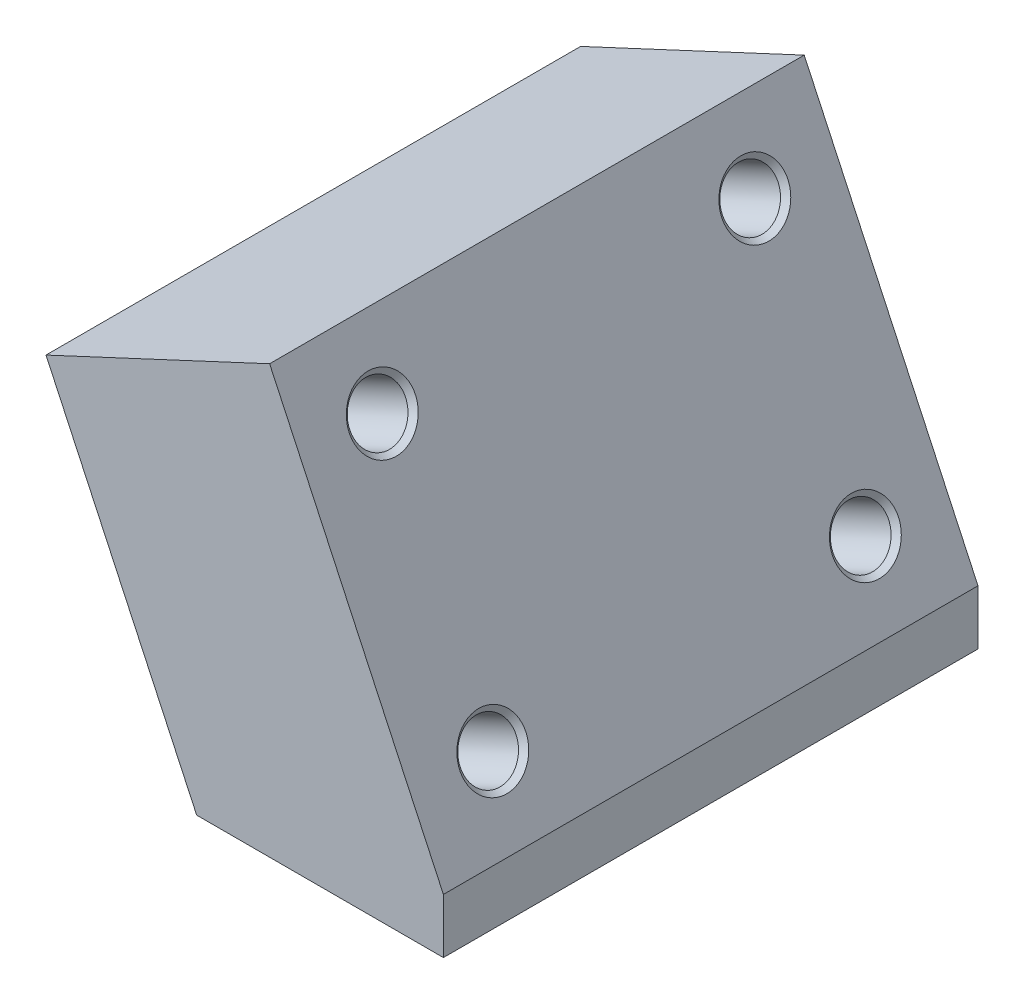
ISO-10303-21;
HEADER;
FILE_DESCRIPTION(('STEP AP214'),'2;1');
FILE_NAME('part.step','',(''),(''),'','','');
FILE_SCHEMA(('AUTOMOTIVE_DESIGN { 1 0 10303 214 1 1 1 1 }'));
ENDSEC;
DATA;
#1=APPLICATION_CONTEXT('core data for automotive mechanical design processes');
#2=APPLICATION_PROTOCOL_DEFINITION('international standard','automotive_design',2000,#1);
#3=PRODUCT_CONTEXT('',#1,'mechanical');
#4=PRODUCT('Part','Part','',(#3));
#5=PRODUCT_RELATED_PRODUCT_CATEGORY('part','',(#4));
#6=PRODUCT_DEFINITION_FORMATION('','',#4);
#7=PRODUCT_DEFINITION_CONTEXT('part definition',#1,'design');
#8=PRODUCT_DEFINITION('design','',#6,#7);
#9=PRODUCT_DEFINITION_SHAPE('','',#8);
#10=(LENGTH_UNIT() NAMED_UNIT(*) SI_UNIT(.MILLI.,.METRE.));
#11=(NAMED_UNIT(*) PLANE_ANGLE_UNIT() SI_UNIT($,.RADIAN.));
#12=(NAMED_UNIT(*) SI_UNIT($,.STERADIAN.) SOLID_ANGLE_UNIT());
#13=UNCERTAINTY_MEASURE_WITH_UNIT(LENGTH_MEASURE(1.E-05),#10,'distance_accuracy_value','');
#14=(GEOMETRIC_REPRESENTATION_CONTEXT(3) GLOBAL_UNCERTAINTY_ASSIGNED_CONTEXT((#13)) GLOBAL_UNIT_ASSIGNED_CONTEXT((#10,
#11,#12)) REPRESENTATION_CONTEXT('',''));
#15=CARTESIAN_POINT('',(0.,0.,0.));
#16=DIRECTION('',(0.,0.,1.));
#17=DIRECTION('',(1.,0.,0.));
#18=AXIS2_PLACEMENT_3D('',#15,#16,#17);
#19=CARTESIAN_POINT('',(1.18032298381495,-74.8106195494456,32.5));
#20=DIRECTION('',(0.422618261740701,-0.906307787036649,0.));
#21=DIRECTION('',(0.906307787036649,0.422618261740701,0.));
#22=AXIS2_PLACEMENT_3D('',#19,#20,#21);
#23=PLANE('',#22);
#24=DIRECTION('',(-0.906307787036649,-0.422618261740701,0.));
#25=VECTOR('',#24,1.);
#26=CARTESIAN_POINT('',(1.18032298381495,-74.8106195494456,-32.5));
#27=LINE('',#26,#25);
#28=CARTESIAN_POINT('',(28.3695565949144,-62.1320716972246,-32.5));
#29=VERTEX_POINT('',#28);
#30=CARTESIAN_POINT('',(1.18032298381495,-74.8106195494456,-32.5));
#31=VERTEX_POINT('',#30);
#32=EDGE_CURVE('E116',#29,#31,#27,.T.);
#33=ORIENTED_EDGE('',*,*,#32,.T.);
#34=DIRECTION('',(0.,0.,-1.));
#35=VECTOR('',#34,1.);
#36=CARTESIAN_POINT('',(1.18032298381495,-74.8106195494456,32.5));
#37=LINE('',#36,#35);
#38=CARTESIAN_POINT('',(1.18032298381495,-74.8106195494456,32.5));
#39=VERTEX_POINT('',#38);
#40=EDGE_CURVE('E11',#39,#31,#37,.T.);
#41=ORIENTED_EDGE('',*,*,#40,.F.);
#42=DIRECTION('',(-0.906307787036649,-0.422618261740701,0.));
#43=VECTOR('',#42,1.);
#44=CARTESIAN_POINT('',(1.18032298381495,-74.8106195494456,32.5));
#45=LINE('',#44,#43);
#46=CARTESIAN_POINT('',(28.3695565949144,-62.1320716972246,32.5));
#47=VERTEX_POINT('',#46);
#48=EDGE_CURVE('E125',#47,#39,#45,.T.);
#49=ORIENTED_EDGE('',*,*,#48,.F.);
#50=DIRECTION('',(0.,0.,-1.));
#51=VECTOR('',#50,1.);
#52=CARTESIAN_POINT('',(28.3695565949144,-62.1320716972246,32.5));
#53=LINE('',#52,#51);
#54=EDGE_CURVE('E112',#47,#29,#53,.T.);
#55=ORIENTED_EDGE('',*,*,#54,.T.);
#56=EDGE_LOOP('',(#33,#41,#49,#55));
#57=FACE_BOUND('',#56,.T.);
#58=ADVANCED_FACE('F37',(#57),#23,.F.);
#59=CARTESIAN_POINT('',(1.18032298381495,-74.8106195494456,32.5));
#60=DIRECTION('',(0.906307787036649,0.422618261740701,0.));
#61=DIRECTION('',(-0.422618261740701,0.906307787036649,0.));
#62=AXIS2_PLACEMENT_3D('',#59,#60,#61);
#63=PLANE('',#62);
#64=DIRECTION('',(0.422618261740701,-0.906307787036649,0.));
#65=VECTOR('',#64,1.);
#66=CARTESIAN_POINT('',(1.18032298381495,-74.8106195494456,-32.5));
#67=LINE('',#66,#65);
#68=CARTESIAN_POINT('',(19.5004696819495,-114.098300928345,-32.5));
#69=VERTEX_POINT('',#68);
#70=EDGE_CURVE('E119',#31,#69,#67,.T.);
#71=ORIENTED_EDGE('',*,*,#70,.T.);
#72=DIRECTION('',(0.,0.,-1.));
#73=VECTOR('',#72,1.);
#74=CARTESIAN_POINT('',(19.5004696819495,-114.098300928345,32.5));
#75=LINE('',#74,#73);
#76=CARTESIAN_POINT('',(19.5004696819495,-114.098300928345,32.5));
#77=VERTEX_POINT('',#76);
#78=EDGE_CURVE('E46',#77,#69,#75,.T.);
#79=ORIENTED_EDGE('',*,*,#78,.F.);
#80=DIRECTION('',(0.422618261740701,-0.906307787036649,0.));
#81=VECTOR('',#80,1.);
#82=CARTESIAN_POINT('',(1.18032298381495,-74.8106195494456,32.5));
#83=LINE('',#82,#81);
#84=EDGE_CURVE('E90',#39,#77,#83,.T.);
#85=ORIENTED_EDGE('',*,*,#84,.F.);
#86=ORIENTED_EDGE('',*,*,#40,.T.);
#87=EDGE_LOOP('',(#71,#79,#85,#86));
#88=FACE_BOUND('',#87,.T.);
#89=ADVANCED_FACE('F180',(#88),#63,.F.);
#90=CARTESIAN_POINT('',(49.5004696819495,-114.098300928345,32.5));
#91=DIRECTION('',(0.,1.,0.));
#92=DIRECTION('',(0.,0.,1.));
#93=AXIS2_PLACEMENT_3D('',#90,#91,#92);
#94=PLANE('',#93);
#95=CARTESIAN_POINT('',(34.5004696819495,-114.098300928345,-10.));
#96=DIRECTION('',(0.,1.,0.));
#97=DIRECTION('',(0.,0.,1.));
#98=AXIS2_PLACEMENT_3D('',#95,#96,#97);
#99=CIRCLE('',#98,3.39999999999999);
#100=CARTESIAN_POINT('',(34.5004696819495,-114.098300928345,-6.60000000000001));
#101=VERTEX_POINT('',#100);
#102=EDGE_CURVE('E40',#101,#101,#99,.T.);
#103=ORIENTED_EDGE('',*,*,#102,.T.);
#104=EDGE_LOOP('',(#103));
#105=FACE_BOUND('',#104,.T.);
#106=CARTESIAN_POINT('',(34.5004696819495,-114.098300928345,10.));
#107=DIRECTION('',(0.,1.,0.));
#108=DIRECTION('',(0.,0.,1.));
#109=AXIS2_PLACEMENT_3D('',#106,#107,#108);
#110=CIRCLE('',#109,3.39999999999999);
#111=CARTESIAN_POINT('',(34.5004696819495,-114.098300928345,13.4));
#112=VERTEX_POINT('',#111);
#113=EDGE_CURVE('E128',#112,#112,#110,.T.);
#114=ORIENTED_EDGE('',*,*,#113,.T.);
#115=EDGE_LOOP('',(#114));
#116=FACE_BOUND('',#115,.T.);
#117=DIRECTION('',(1.,0.,0.));
#118=VECTOR('',#117,1.);
#119=CARTESIAN_POINT('',(49.5004696819495,-114.098300928345,-32.5));
#120=LINE('',#119,#118);
#121=CARTESIAN_POINT('',(49.5004696819495,-114.098300928345,-32.5));
#122=VERTEX_POINT('',#121);
#123=EDGE_CURVE('E107',#69,#122,#120,.T.);
#124=ORIENTED_EDGE('',*,*,#123,.T.);
#125=DIRECTION('',(0.,0.,-1.));
#126=VECTOR('',#125,1.);
#127=CARTESIAN_POINT('',(49.5004696819495,-114.098300928345,32.5));
#128=LINE('',#127,#126);
#129=CARTESIAN_POINT('',(49.5004696819495,-114.098300928345,32.5));
#130=VERTEX_POINT('',#129);
#131=EDGE_CURVE('E104',#130,#122,#128,.T.);
#132=ORIENTED_EDGE('',*,*,#131,.F.);
#133=DIRECTION('',(1.,0.,0.));
#134=VECTOR('',#133,1.);
#135=CARTESIAN_POINT('',(49.5004696819495,-114.098300928345,32.5));
#136=LINE('',#135,#134);
#137=EDGE_CURVE('E96',#77,#130,#136,.T.);
#138=ORIENTED_EDGE('',*,*,#137,.F.);
#139=ORIENTED_EDGE('',*,*,#78,.T.);
#140=EDGE_LOOP('',(#124,#132,#138,#139));
#141=FACE_BOUND('',#140,.T.);
#142=ADVANCED_FACE('F105',(#105,#116,#141),#94,.F.);
#143=CARTESIAN_POINT('',(49.5004696819495,-114.098300928345,32.5));
#144=DIRECTION('',(-1.,0.,0.));
#145=DIRECTION('',(0.,0.,1.));
#146=AXIS2_PLACEMENT_3D('',#143,#144,#145);
#147=PLANE('',#146);
#148=DIRECTION('',(0.,1.,0.));
#149=VECTOR('',#148,1.);
#150=CARTESIAN_POINT('',(49.5004696819495,-114.098300928345,-32.5));
#151=LINE('',#150,#149);
#152=CARTESIAN_POINT('',(49.5004696819495,-107.447461049057,-32.5));
#153=VERTEX_POINT('',#152);
#154=EDGE_CURVE('E76',#122,#153,#151,.T.);
#155=ORIENTED_EDGE('',*,*,#154,.T.);
#156=DIRECTION('',(0.,0.,-1.));
#157=VECTOR('',#156,1.);
#158=CARTESIAN_POINT('',(49.5004696819495,-107.447461049057,32.5));
#159=LINE('',#158,#157);
#160=CARTESIAN_POINT('',(49.5004696819495,-107.447461049057,32.5));
#161=VERTEX_POINT('',#160);
#162=EDGE_CURVE('E108',#161,#153,#159,.T.);
#163=ORIENTED_EDGE('',*,*,#162,.F.);
#164=DIRECTION('',(0.,1.,0.));
#165=VECTOR('',#164,1.);
#166=CARTESIAN_POINT('',(49.5004696819495,-114.098300928345,32.5));
#167=LINE('',#166,#165);
#168=EDGE_CURVE('E100',#130,#161,#167,.T.);
#169=ORIENTED_EDGE('',*,*,#168,.F.);
#170=ORIENTED_EDGE('',*,*,#131,.T.);
#171=EDGE_LOOP('',(#155,#163,#169,#170));
#172=FACE_BOUND('',#171,.T.);
#173=ADVANCED_FACE('F110',(#172),#147,.F.);
#174=CARTESIAN_POINT('',(49.5004696819495,-107.447461049057,32.5));
#175=DIRECTION('',(-0.906307787036649,-0.422618261740701,0.));
#176=DIRECTION('',(0.422618261740701,-0.906307787036649,0.));
#177=AXIS2_PLACEMENT_3D('',#174,#175,#176);
#178=PLANE('',#177);
#179=CARTESIAN_POINT('',(32.2153827767583,-70.3794725592654,22.65));
#180=DIRECTION('',(0.906307787036649,0.422618261740701,0.));
#181=DIRECTION('',(-0.422618261740701,0.906307787036649,0.));
#182=AXIS2_PLACEMENT_3D('',#179,#180,#181);
#183=CIRCLE('',#182,4.025);
#184=CARTESIAN_POINT('',(30.5143442732519,-66.7315837164429,22.65));
#185=VERTEX_POINT('',#184);
#186=EDGE_CURVE('E130',#185,#185,#183,.T.);
#187=ORIENTED_EDGE('',*,*,#186,.F.);
#188=EDGE_LOOP('',(#187));
#189=FACE_BOUND('',#188,.T.);
#190=CARTESIAN_POINT('',(45.6546435001057,-99.2000601870162,22.65));
#191=DIRECTION('',(0.906307787036649,0.422618261740701,0.));
#192=DIRECTION('',(-0.422618261740701,0.906307787036649,0.));
#193=AXIS2_PLACEMENT_3D('',#190,#191,#192);
#194=CIRCLE('',#193,4.025);
#195=CARTESIAN_POINT('',(43.9536049965994,-95.5521713441937,22.65));
#196=VERTEX_POINT('',#195);
#197=EDGE_CURVE('E150',#196,#196,#194,.T.);
#198=ORIENTED_EDGE('',*,*,#197,.F.);
#199=EDGE_LOOP('',(#198));
#200=FACE_BOUND('',#199,.T.);
#201=CARTESIAN_POINT('',(45.6546435001057,-99.2000601870162,-22.65));
#202=DIRECTION('',(0.906307787036649,0.422618261740701,0.));
#203=DIRECTION('',(-0.422618261740701,0.906307787036649,0.));
#204=AXIS2_PLACEMENT_3D('',#201,#202,#203);
#205=CIRCLE('',#204,4.025);
#206=CARTESIAN_POINT('',(43.9536049965994,-95.5521713441937,-22.65));
#207=VERTEX_POINT('',#206);
#208=EDGE_CURVE('E159',#207,#207,#205,.T.);
#209=ORIENTED_EDGE('',*,*,#208,.F.);
#210=EDGE_LOOP('',(#209));
#211=FACE_BOUND('',#210,.T.);
#212=CARTESIAN_POINT('',(32.2153827767583,-70.3794725592654,-22.65));
#213=DIRECTION('',(0.906307787036649,0.422618261740701,0.));
#214=DIRECTION('',(-0.422618261740701,0.906307787036649,0.));
#215=AXIS2_PLACEMENT_3D('',#212,#213,#214);
#216=CIRCLE('',#215,4.025);
#217=CARTESIAN_POINT('',(30.5143442732519,-66.7315837164429,-22.65));
#218=VERTEX_POINT('',#217);
#219=EDGE_CURVE('E168',#218,#218,#216,.T.);
#220=ORIENTED_EDGE('',*,*,#219,.F.);
#221=EDGE_LOOP('',(#220));
#222=FACE_BOUND('',#221,.T.);
#223=DIRECTION('',(-0.422618261740701,0.906307787036649,0.));
#224=VECTOR('',#223,1.);
#225=CARTESIAN_POINT('',(49.5004696819495,-107.447461049057,-32.5));
#226=LINE('',#225,#224);
#227=EDGE_CURVE('E82',#153,#29,#226,.T.);
#228=ORIENTED_EDGE('',*,*,#227,.T.);
#229=ORIENTED_EDGE('',*,*,#54,.F.);
#230=DIRECTION('',(-0.422618261740701,0.906307787036649,0.));
#231=VECTOR('',#230,1.);
#232=CARTESIAN_POINT('',(49.5004696819495,-107.447461049057,32.5));
#233=LINE('',#232,#231);
#234=EDGE_CURVE('E55',#161,#47,#233,.T.);
#235=ORIENTED_EDGE('',*,*,#234,.F.);
#236=ORIENTED_EDGE('',*,*,#162,.T.);
#237=EDGE_LOOP('',(#228,#229,#235,#236));
#238=FACE_BOUND('',#237,.T.);
#239=ADVANCED_FACE('F193',(#189,#200,#211,#222,#238),#178,.F.);
#240=CARTESIAN_POINT('',(0.,0.,32.5));
#241=DIRECTION('',(0.,0.,1.));
#242=DIRECTION('',(1.,0.,0.));
#243=AXIS2_PLACEMENT_3D('',#240,#241,#242);
#244=PLANE('',#243);
#245=ORIENTED_EDGE('',*,*,#48,.T.);
#246=ORIENTED_EDGE('',*,*,#84,.T.);
#247=ORIENTED_EDGE('',*,*,#137,.T.);
#248=ORIENTED_EDGE('',*,*,#168,.T.);
#249=ORIENTED_EDGE('',*,*,#234,.T.);
#250=EDGE_LOOP('',(#245,#246,#247,#248,#249));
#251=FACE_BOUND('',#250,.T.);
#252=ADVANCED_FACE('F98',(#251),#244,.T.);
#253=CARTESIAN_POINT('',(0.,0.,-32.5));
#254=DIRECTION('',(0.,0.,1.));
#255=DIRECTION('',(1.,0.,0.));
#256=AXIS2_PLACEMENT_3D('',#253,#254,#255);
#257=PLANE('',#256);
#258=ORIENTED_EDGE('',*,*,#32,.F.);
#259=ORIENTED_EDGE('',*,*,#227,.F.);
#260=ORIENTED_EDGE('',*,*,#154,.F.);
#261=ORIENTED_EDGE('',*,*,#123,.F.);
#262=ORIENTED_EDGE('',*,*,#70,.F.);
#263=EDGE_LOOP('',(#258,#259,#260,#261,#262));
#264=FACE_BOUND('',#263,.T.);
#265=ADVANCED_FACE('F182',(#264),#257,.F.);
#266=CARTESIAN_POINT('',(14.0892270360253,-78.8318377940794,-22.65));
#267=DIRECTION('',(0.906307787036649,0.422618261740701,0.));
#268=DIRECTION('',(-0.422618261740701,0.906307787036649,0.));
#269=AXIS2_PLACEMENT_3D('',#266,#267,#268);
#270=CONICAL_SURFACE('',#269,3.4,1.02974425867665);
#271=CARTESIAN_POINT('',(12.2377071990009,-79.6952156733098,-22.65));
#272=VERTEX_POINT('',#271);
#273=VERTEX_LOOP('',#272);
#274=FACE_BOUND('',#273,.T.);
#275=CARTESIAN_POINT('',(14.0892270360253,-78.8318377940794,-22.65));
#276=DIRECTION('',(0.906307787036649,0.422618261740701,0.));
#277=DIRECTION('',(-0.422618261740701,0.906307787036649,0.));
#278=AXIS2_PLACEMENT_3D('',#275,#276,#277);
#279=CIRCLE('',#278,3.4);
#280=CARTESIAN_POINT('',(12.6523249461069,-75.7503913181548,-22.65));
#281=VERTEX_POINT('',#280);
#282=EDGE_CURVE('E120',#281,#281,#279,.T.);
#283=ORIENTED_EDGE('',*,*,#282,.T.);
#284=EDGE_LOOP('',(#283));
#285=FACE_BOUND('',#284,.T.);
#286=ADVANCED_FACE('F184',(#274,#285),#270,.F.);
#287=CARTESIAN_POINT('',(32.2153827767583,-70.3794725592654,-22.65));
#288=DIRECTION('',(0.906307787036649,0.422618261740701,0.));
#289=DIRECTION('',(-0.422618261740701,0.906307787036649,0.));
#290=AXIS2_PLACEMENT_3D('',#287,#288,#289);
#291=CYLINDRICAL_SURFACE('',#290,3.4);
#292=ORIENTED_EDGE('',*,*,#282,.F.);
#293=EDGE_LOOP('',(#292));
#294=FACE_BOUND('',#293,.T.);
#295=CARTESIAN_POINT('',(31.6489404098603,-70.6436089728533,-22.65));
#296=DIRECTION('',(0.906307787036649,0.422618261740701,0.));
#297=DIRECTION('',(-0.422618261740701,0.906307787036649,0.));
#298=AXIS2_PLACEMENT_3D('',#295,#296,#297);
#299=CIRCLE('',#298,3.4);
#300=CARTESIAN_POINT('',(30.212038319942,-67.5621624969287,-22.65));
#301=VERTEX_POINT('',#300);
#302=EDGE_CURVE('E171',#301,#301,#299,.T.);
#303=ORIENTED_EDGE('',*,*,#302,.T.);
#304=EDGE_LOOP('',(#303));
#305=FACE_BOUND('',#304,.T.);
#306=ADVANCED_FACE('F190',(#294,#305),#291,.F.);
#307=CARTESIAN_POINT('',(32.2153827767583,-70.3794725592654,-22.65));
#308=DIRECTION('',(0.906307787036649,0.422618261740701,0.));
#309=DIRECTION('',(-0.422618261740701,0.906307787036649,0.));
#310=AXIS2_PLACEMENT_3D('',#307,#308,#309);
#311=CONICAL_SURFACE('',#310,4.025,0.785398163397449);
#312=ORIENTED_EDGE('',*,*,#302,.F.);
#313=EDGE_LOOP('',(#312));
#314=FACE_BOUND('',#313,.T.);
#315=ORIENTED_EDGE('',*,*,#219,.T.);
#316=EDGE_LOOP('',(#315));
#317=FACE_BOUND('',#316,.T.);
#318=ADVANCED_FACE('F219',(#314,#317),#311,.F.);
#319=CARTESIAN_POINT('',(27.5284877593728,-107.65242542183,-22.65));
#320=DIRECTION('',(0.906307787036649,0.422618261740701,0.));
#321=DIRECTION('',(-0.422618261740701,0.906307787036649,0.));
#322=AXIS2_PLACEMENT_3D('',#319,#320,#321);
#323=CONICAL_SURFACE('',#322,3.4,1.02974425867665);
#324=CARTESIAN_POINT('',(25.6769679223484,-108.515803301061,-22.65));
#325=VERTEX_POINT('',#324);
#326=VERTEX_LOOP('',#325);
#327=FACE_BOUND('',#326,.T.);
#328=CARTESIAN_POINT('',(27.5284877593728,-107.65242542183,-22.65));
#329=DIRECTION('',(0.906307787036649,0.422618261740701,0.));
#330=DIRECTION('',(-0.422618261740701,0.906307787036649,0.));
#331=AXIS2_PLACEMENT_3D('',#328,#329,#330);
#332=CIRCLE('',#331,3.4);
#333=CARTESIAN_POINT('',(26.0915856694544,-104.570978945906,-22.65));
#334=VERTEX_POINT('',#333);
#335=EDGE_CURVE('E165',#334,#334,#332,.T.);
#336=ORIENTED_EDGE('',*,*,#335,.T.);
#337=EDGE_LOOP('',(#336));
#338=FACE_BOUND('',#337,.T.);
#339=ADVANCED_FACE('F221',(#327,#338),#323,.F.);
#340=CARTESIAN_POINT('',(45.6546435001057,-99.2000601870162,-22.65));
#341=DIRECTION('',(0.906307787036649,0.422618261740701,0.));
#342=DIRECTION('',(-0.422618261740701,0.906307787036649,0.));
#343=AXIS2_PLACEMENT_3D('',#340,#341,#342);
#344=CYLINDRICAL_SURFACE('',#343,3.4);
#345=ORIENTED_EDGE('',*,*,#335,.F.);
#346=EDGE_LOOP('',(#345));
#347=FACE_BOUND('',#346,.T.);
#348=CARTESIAN_POINT('',(45.0882011332078,-99.4641966006041,-22.65));
#349=DIRECTION('',(0.906307787036649,0.422618261740701,0.));
#350=DIRECTION('',(-0.422618261740701,0.906307787036649,0.));
#351=AXIS2_PLACEMENT_3D('',#348,#349,#350);
#352=CIRCLE('',#351,3.4);
#353=CARTESIAN_POINT('',(43.6512990432894,-96.3827501246795,-22.65));
#354=VERTEX_POINT('',#353);
#355=EDGE_CURVE('E162',#354,#354,#352,.T.);
#356=ORIENTED_EDGE('',*,*,#355,.T.);
#357=EDGE_LOOP('',(#356));
#358=FACE_BOUND('',#357,.T.);
#359=ADVANCED_FACE('F228',(#347,#358),#344,.F.);
#360=CARTESIAN_POINT('',(45.6546435001057,-99.2000601870162,-22.65));
#361=DIRECTION('',(0.906307787036649,0.422618261740701,0.));
#362=DIRECTION('',(-0.422618261740701,0.906307787036649,0.));
#363=AXIS2_PLACEMENT_3D('',#360,#361,#362);
#364=CONICAL_SURFACE('',#363,4.025,0.785398163397449);
#365=ORIENTED_EDGE('',*,*,#355,.F.);
#366=EDGE_LOOP('',(#365));
#367=FACE_BOUND('',#366,.T.);
#368=ORIENTED_EDGE('',*,*,#208,.T.);
#369=EDGE_LOOP('',(#368));
#370=FACE_BOUND('',#369,.T.);
#371=ADVANCED_FACE('F237',(#367,#370),#364,.F.);
#372=CARTESIAN_POINT('',(27.5284877593728,-107.65242542183,22.65));
#373=DIRECTION('',(0.906307787036649,0.422618261740701,0.));
#374=DIRECTION('',(-0.422618261740701,0.906307787036649,0.));
#375=AXIS2_PLACEMENT_3D('',#372,#373,#374);
#376=CONICAL_SURFACE('',#375,3.4,1.02974425867665);
#377=CARTESIAN_POINT('',(25.6769679223484,-108.515803301061,22.65));
#378=VERTEX_POINT('',#377);
#379=VERTEX_LOOP('',#378);
#380=FACE_BOUND('',#379,.T.);
#381=CARTESIAN_POINT('',(27.5284877593728,-107.65242542183,22.65));
#382=DIRECTION('',(0.906307787036649,0.422618261740701,0.));
#383=DIRECTION('',(-0.422618261740701,0.906307787036649,0.));
#384=AXIS2_PLACEMENT_3D('',#381,#382,#383);
#385=CIRCLE('',#384,3.4);
#386=CARTESIAN_POINT('',(26.0915856694544,-104.570978945906,22.65));
#387=VERTEX_POINT('',#386);
#388=EDGE_CURVE('E156',#387,#387,#385,.T.);
#389=ORIENTED_EDGE('',*,*,#388,.T.);
#390=EDGE_LOOP('',(#389));
#391=FACE_BOUND('',#390,.T.);
#392=ADVANCED_FACE('F241',(#380,#391),#376,.F.);
#393=CARTESIAN_POINT('',(45.6546435001057,-99.2000601870162,22.65));
#394=DIRECTION('',(0.906307787036649,0.422618261740701,0.));
#395=DIRECTION('',(-0.422618261740701,0.906307787036649,0.));
#396=AXIS2_PLACEMENT_3D('',#393,#394,#395);
#397=CYLINDRICAL_SURFACE('',#396,3.4);
#398=ORIENTED_EDGE('',*,*,#388,.F.);
#399=EDGE_LOOP('',(#398));
#400=FACE_BOUND('',#399,.T.);
#401=CARTESIAN_POINT('',(45.0882011332078,-99.4641966006041,22.65));
#402=DIRECTION('',(0.906307787036649,0.422618261740701,0.));
#403=DIRECTION('',(-0.422618261740701,0.906307787036649,0.));
#404=AXIS2_PLACEMENT_3D('',#401,#402,#403);
#405=CIRCLE('',#404,3.4);
#406=CARTESIAN_POINT('',(43.6512990432894,-96.3827501246795,22.65));
#407=VERTEX_POINT('',#406);
#408=EDGE_CURVE('E153',#407,#407,#405,.T.);
#409=ORIENTED_EDGE('',*,*,#408,.T.);
#410=EDGE_LOOP('',(#409));
#411=FACE_BOUND('',#410,.T.);
#412=ADVANCED_FACE('F245',(#400,#411),#397,.F.);
#413=CARTESIAN_POINT('',(45.6546435001057,-99.2000601870162,22.65));
#414=DIRECTION('',(0.906307787036649,0.422618261740701,0.));
#415=DIRECTION('',(-0.422618261740701,0.906307787036649,0.));
#416=AXIS2_PLACEMENT_3D('',#413,#414,#415);
#417=CONICAL_SURFACE('',#416,4.025,0.785398163397449);
#418=ORIENTED_EDGE('',*,*,#408,.F.);
#419=EDGE_LOOP('',(#418));
#420=FACE_BOUND('',#419,.T.);
#421=ORIENTED_EDGE('',*,*,#197,.T.);
#422=EDGE_LOOP('',(#421));
#423=FACE_BOUND('',#422,.T.);
#424=ADVANCED_FACE('F249',(#420,#423),#417,.F.);
#425=CARTESIAN_POINT('',(14.0892270360253,-78.8318377940794,22.65));
#426=DIRECTION('',(0.906307787036649,0.422618261740701,0.));
#427=DIRECTION('',(-0.422618261740701,0.906307787036649,0.));
#428=AXIS2_PLACEMENT_3D('',#425,#426,#427);
#429=CONICAL_SURFACE('',#428,3.4,1.02974425867665);
#430=CARTESIAN_POINT('',(12.2377071990009,-79.6952156733098,22.65));
#431=VERTEX_POINT('',#430);
#432=VERTEX_LOOP('',#431);
#433=FACE_BOUND('',#432,.T.);
#434=CARTESIAN_POINT('',(14.0892270360253,-78.8318377940794,22.65));
#435=DIRECTION('',(0.906307787036649,0.422618261740701,0.));
#436=DIRECTION('',(-0.422618261740701,0.906307787036649,0.));
#437=AXIS2_PLACEMENT_3D('',#434,#435,#436);
#438=CIRCLE('',#437,3.4);
#439=CARTESIAN_POINT('',(12.6523249461069,-75.7503913181548,22.65));
#440=VERTEX_POINT('',#439);
#441=EDGE_CURVE('E147',#440,#440,#438,.T.);
#442=ORIENTED_EDGE('',*,*,#441,.T.);
#443=EDGE_LOOP('',(#442));
#444=FACE_BOUND('',#443,.T.);
#445=ADVANCED_FACE('F253',(#433,#444),#429,.F.);
#446=CARTESIAN_POINT('',(32.2153827767583,-70.3794725592654,22.65));
#447=DIRECTION('',(0.906307787036649,0.422618261740701,0.));
#448=DIRECTION('',(-0.422618261740701,0.906307787036649,0.));
#449=AXIS2_PLACEMENT_3D('',#446,#447,#448);
#450=CYLINDRICAL_SURFACE('',#449,3.4);
#451=ORIENTED_EDGE('',*,*,#441,.F.);
#452=EDGE_LOOP('',(#451));
#453=FACE_BOUND('',#452,.T.);
#454=CARTESIAN_POINT('',(31.6489404098603,-70.6436089728533,22.65));
#455=DIRECTION('',(0.906307787036649,0.422618261740701,0.));
#456=DIRECTION('',(-0.422618261740701,0.906307787036649,0.));
#457=AXIS2_PLACEMENT_3D('',#454,#455,#456);
#458=CIRCLE('',#457,3.4);
#459=CARTESIAN_POINT('',(30.212038319942,-67.5621624969287,22.65));
#460=VERTEX_POINT('',#459);
#461=EDGE_CURVE('E135',#460,#460,#458,.T.);
#462=ORIENTED_EDGE('',*,*,#461,.T.);
#463=EDGE_LOOP('',(#462));
#464=FACE_BOUND('',#463,.T.);
#465=ADVANCED_FACE('F257',(#453,#464),#450,.F.);
#466=CARTESIAN_POINT('',(32.2153827767583,-70.3794725592654,22.65));
#467=DIRECTION('',(0.906307787036649,0.422618261740701,0.));
#468=DIRECTION('',(-0.422618261740701,0.906307787036649,0.));
#469=AXIS2_PLACEMENT_3D('',#466,#467,#468);
#470=CONICAL_SURFACE('',#469,4.025,0.785398163397449);
#471=ORIENTED_EDGE('',*,*,#461,.F.);
#472=EDGE_LOOP('',(#471));
#473=FACE_BOUND('',#472,.T.);
#474=ORIENTED_EDGE('',*,*,#186,.T.);
#475=EDGE_LOOP('',(#474));
#476=FACE_BOUND('',#475,.T.);
#477=ADVANCED_FACE('F261',(#473,#476),#470,.F.);
#478=CARTESIAN_POINT('',(34.5004696819495,-134.098300928345,10.));
#479=DIRECTION('',(0.,-1.,0.));
#480=DIRECTION('',(0.,0.,-1.));
#481=AXIS2_PLACEMENT_3D('',#478,#479,#480);
#482=CYLINDRICAL_SURFACE('',#481,3.39999999999999);
#483=CARTESIAN_POINT('',(34.5004696819495,-98.0983009283453,10.));
#484=DIRECTION('',(0.,-1.,0.));
#485=DIRECTION('',(0.,0.,-1.));
#486=AXIS2_PLACEMENT_3D('',#483,#484,#485);
#487=CIRCLE('',#486,3.39999999999999);
#488=CARTESIAN_POINT('',(34.5004696819495,-98.0983009283453,6.60000000000001));
#489=VERTEX_POINT('',#488);
#490=EDGE_CURVE('E131',#489,#489,#487,.T.);
#491=ORIENTED_EDGE('',*,*,#490,.F.);
#492=EDGE_LOOP('',(#491));
#493=FACE_BOUND('',#492,.T.);
#494=ORIENTED_EDGE('',*,*,#113,.F.);
#495=EDGE_LOOP('',(#494));
#496=FACE_BOUND('',#495,.T.);
#497=ADVANCED_FACE('F265',(#493,#496),#482,.F.);
#498=CARTESIAN_POINT('',(34.5004696819495,-98.0983009283453,10.));
#499=DIRECTION('',(0.,-1.,0.));
#500=DIRECTION('',(0.,0.,-1.));
#501=AXIS2_PLACEMENT_3D('',#498,#499,#500);
#502=CONICAL_SURFACE('',#501,3.39999999999999,1.02974425867665);
#503=CARTESIAN_POINT('',(34.5004696819495,-96.0553748236516,10.));
#504=VERTEX_POINT('',#503);
#505=VERTEX_LOOP('',#504);
#506=FACE_BOUND('',#505,.T.);
#507=ORIENTED_EDGE('',*,*,#490,.T.);
#508=EDGE_LOOP('',(#507));
#509=FACE_BOUND('',#508,.T.);
#510=ADVANCED_FACE('F267',(#506,#509),#502,.F.);
#511=CARTESIAN_POINT('',(34.5004696819495,-134.098300928345,-10.));
#512=DIRECTION('',(0.,-1.,0.));
#513=DIRECTION('',(0.,0.,-1.));
#514=AXIS2_PLACEMENT_3D('',#511,#512,#513);
#515=CYLINDRICAL_SURFACE('',#514,3.39999999999999);
#516=CARTESIAN_POINT('',(34.5004696819495,-98.0983009283453,-10.));
#517=DIRECTION('',(0.,-1.,0.));
#518=DIRECTION('',(0.,0.,-1.));
#519=AXIS2_PLACEMENT_3D('',#516,#517,#518);
#520=CIRCLE('',#519,3.39999999999999);
#521=CARTESIAN_POINT('',(34.5004696819495,-98.0983009283453,-13.4));
#522=VERTEX_POINT('',#521);
#523=EDGE_CURVE('E142',#522,#522,#520,.T.);
#524=ORIENTED_EDGE('',*,*,#523,.F.);
#525=EDGE_LOOP('',(#524));
#526=FACE_BOUND('',#525,.T.);
#527=ORIENTED_EDGE('',*,*,#102,.F.);
#528=EDGE_LOOP('',(#527));
#529=FACE_BOUND('',#528,.T.);
#530=ADVANCED_FACE('F270',(#526,#529),#515,.F.);
#531=CARTESIAN_POINT('',(34.5004696819495,-98.0983009283453,-10.));
#532=DIRECTION('',(0.,-1.,0.));
#533=DIRECTION('',(0.,0.,-1.));
#534=AXIS2_PLACEMENT_3D('',#531,#532,#533);
#535=CONICAL_SURFACE('',#534,3.39999999999999,1.02974425867665);
#536=CARTESIAN_POINT('',(34.5004696819495,-96.0553748236516,-10.));
#537=VERTEX_POINT('',#536);
#538=VERTEX_LOOP('',#537);
#539=FACE_BOUND('',#538,.T.);
#540=ORIENTED_EDGE('',*,*,#523,.T.);
#541=EDGE_LOOP('',(#540));
#542=FACE_BOUND('',#541,.T.);
#543=ADVANCED_FACE('F275',(#539,#542),#535,.F.);
#544=CLOSED_SHELL('',(#58,#89,#142,#173,#239,#252,#265,#286,#306,#318,#339,#359,#371,#392,#412,
#424,#445,#465,#477,#497,#510,#530,#543));
#545=MANIFOLD_SOLID_BREP('B2',#544);
#546=ADVANCED_BREP_SHAPE_REPRESENTATION('',(#18,#545),#14);
#547=SHAPE_DEFINITION_REPRESENTATION(#9,#546);
ENDSEC;
END-ISO-10303-21;
